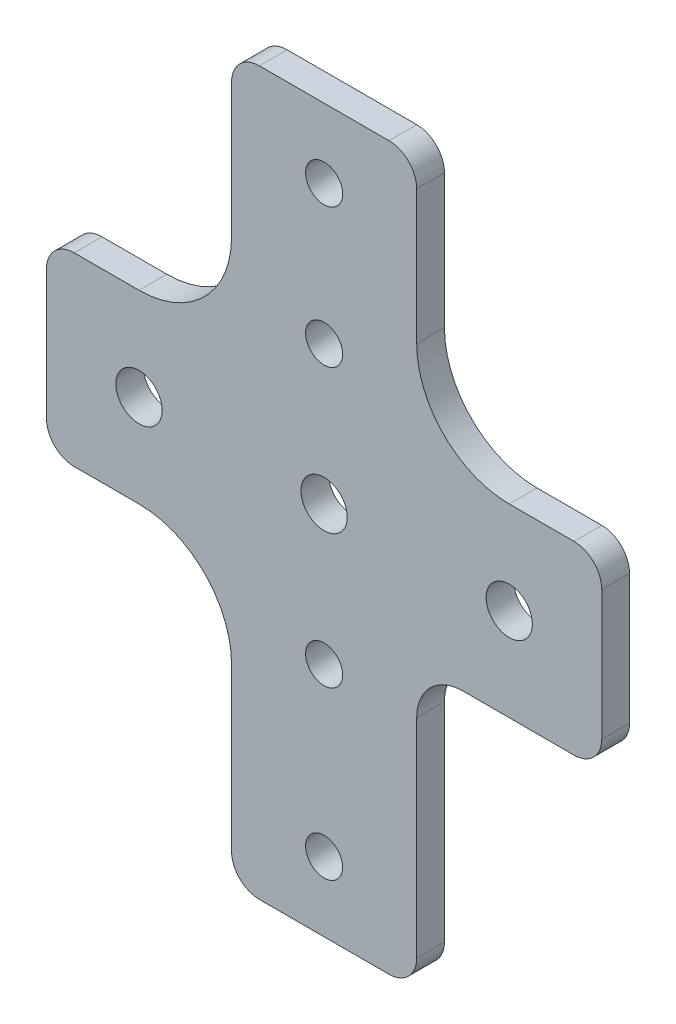
ISO-10303-21;
HEADER;
FILE_DESCRIPTION(('STEP AP214'),'2;1');
FILE_NAME('part.step','',(''),(''),'','','');
FILE_SCHEMA(('AUTOMOTIVE_DESIGN { 1 0 10303 214 1 1 1 1 }'));
ENDSEC;
DATA;
#1=APPLICATION_CONTEXT('core data for automotive mechanical design processes');
#2=APPLICATION_PROTOCOL_DEFINITION('international standard','automotive_design',2000,#1);
#3=PRODUCT_CONTEXT('',#1,'mechanical');
#4=PRODUCT('Part','Part','',(#3));
#5=PRODUCT_RELATED_PRODUCT_CATEGORY('part','',(#4));
#6=PRODUCT_DEFINITION_FORMATION('','',#4);
#7=PRODUCT_DEFINITION_CONTEXT('part definition',#1,'design');
#8=PRODUCT_DEFINITION('design','',#6,#7);
#9=PRODUCT_DEFINITION_SHAPE('','',#8);
#10=(LENGTH_UNIT() NAMED_UNIT(*) SI_UNIT(.MILLI.,.METRE.));
#11=(NAMED_UNIT(*) PLANE_ANGLE_UNIT() SI_UNIT($,.RADIAN.));
#12=(NAMED_UNIT(*) SI_UNIT($,.STERADIAN.) SOLID_ANGLE_UNIT());
#13=UNCERTAINTY_MEASURE_WITH_UNIT(LENGTH_MEASURE(1.E-05),#10,'distance_accuracy_value','');
#14=(GEOMETRIC_REPRESENTATION_CONTEXT(3) GLOBAL_UNCERTAINTY_ASSIGNED_CONTEXT((#13)) GLOBAL_UNIT_ASSIGNED_CONTEXT((#10,
#11,#12)) REPRESENTATION_CONTEXT('',''));
#15=CARTESIAN_POINT('',(0.,0.,0.));
#16=DIRECTION('',(0.,0.,1.));
#17=DIRECTION('',(1.,0.,0.));
#18=AXIS2_PLACEMENT_3D('',#15,#16,#17);
#19=CARTESIAN_POINT('',(-30.,10.,3.));
#20=DIRECTION('',(0.,-1.,0.));
#21=DIRECTION('',(0.,0.,-1.));
#22=AXIS2_PLACEMENT_3D('',#19,#20,#21);
#23=PLANE('',#22);
#24=DIRECTION('',(-1.,0.,0.));
#25=VECTOR('',#24,1.);
#26=CARTESIAN_POINT('',(-30.,10.,0.));
#27=LINE('',#26,#25);
#28=CARTESIAN_POINT('',(-20.,10.,0.));
#29=VERTEX_POINT('',#28);
#30=CARTESIAN_POINT('',(-27.,10.,0.));
#31=VERTEX_POINT('',#30);
#32=EDGE_CURVE('E210',#29,#31,#27,.T.);
#33=ORIENTED_EDGE('',*,*,#32,.T.);
#34=DIRECTION('',(0.,0.,-1.));
#35=VECTOR('',#34,1.);
#36=CARTESIAN_POINT('',(-27.,10.,3.));
#37=LINE('',#36,#35);
#38=CARTESIAN_POINT('',(-27.,10.,3.));
#39=VERTEX_POINT('',#38);
#40=EDGE_CURVE('E344',#31,#39,#37,.F.);
#41=ORIENTED_EDGE('',*,*,#40,.T.);
#42=DIRECTION('',(-1.,0.,0.));
#43=VECTOR('',#42,1.);
#44=CARTESIAN_POINT('',(-30.,10.,3.));
#45=LINE('',#44,#43);
#46=CARTESIAN_POINT('',(-20.,10.,3.));
#47=VERTEX_POINT('',#46);
#48=EDGE_CURVE('E213',#47,#39,#45,.T.);
#49=ORIENTED_EDGE('',*,*,#48,.F.);
#50=DIRECTION('',(0.,0.,-1.));
#51=VECTOR('',#50,1.);
#52=CARTESIAN_POINT('',(-20.,10.,0.));
#53=LINE('',#52,#51);
#54=EDGE_CURVE('E199',#47,#29,#53,.T.);
#55=ORIENTED_EDGE('',*,*,#54,.T.);
#56=EDGE_LOOP('',(#33,#41,#49,#55));
#57=FACE_BOUND('',#56,.T.);
#58=ADVANCED_FACE('F33',(#57),#23,.F.);
#59=CARTESIAN_POINT('',(-30.,-10.,3.));
#60=DIRECTION('',(1.,0.,0.));
#61=DIRECTION('',(0.,0.,-1.));
#62=AXIS2_PLACEMENT_3D('',#59,#60,#61);
#63=PLANE('',#62);
#64=DIRECTION('',(0.,-1.,0.));
#65=VECTOR('',#64,1.);
#66=CARTESIAN_POINT('',(-30.,-10.,0.));
#67=LINE('',#66,#65);
#68=CARTESIAN_POINT('',(-30.,7.,0.));
#69=VERTEX_POINT('',#68);
#70=CARTESIAN_POINT('',(-30.,-7.,0.));
#71=VERTEX_POINT('',#70);
#72=EDGE_CURVE('E219',#69,#71,#67,.T.);
#73=ORIENTED_EDGE('',*,*,#72,.T.);
#74=DIRECTION('',(0.,0.,-1.));
#75=VECTOR('',#74,1.);
#76=CARTESIAN_POINT('',(-30.,-7.,3.));
#77=LINE('',#76,#75);
#78=CARTESIAN_POINT('',(-30.,-7.,3.));
#79=VERTEX_POINT('',#78);
#80=EDGE_CURVE('E342',#71,#79,#77,.F.);
#81=ORIENTED_EDGE('',*,*,#80,.T.);
#82=DIRECTION('',(0.,-1.,0.));
#83=VECTOR('',#82,1.);
#84=CARTESIAN_POINT('',(-30.,-10.,3.));
#85=LINE('',#84,#83);
#86=CARTESIAN_POINT('',(-30.,7.,3.));
#87=VERTEX_POINT('',#86);
#88=EDGE_CURVE('E441',#87,#79,#85,.T.);
#89=ORIENTED_EDGE('',*,*,#88,.F.);
#90=DIRECTION('',(0.,0.,-1.));
#91=VECTOR('',#90,1.);
#92=CARTESIAN_POINT('',(-30.,7.,3.));
#93=LINE('',#92,#91);
#94=EDGE_CURVE('E339',#87,#69,#93,.T.);
#95=ORIENTED_EDGE('',*,*,#94,.T.);
#96=EDGE_LOOP('',(#73,#81,#89,#95));
#97=FACE_BOUND('',#96,.T.);
#98=ADVANCED_FACE('F411',(#97),#63,.F.);
#99=CARTESIAN_POINT('',(-30.,-10.,3.));
#100=DIRECTION('',(0.,1.,0.));
#101=DIRECTION('',(0.,0.,1.));
#102=AXIS2_PLACEMENT_3D('',#99,#100,#101);
#103=PLANE('',#102);
#104=DIRECTION('',(1.,0.,0.));
#105=VECTOR('',#104,1.);
#106=CARTESIAN_POINT('',(-30.,-10.,3.));
#107=LINE('',#106,#105);
#108=CARTESIAN_POINT('',(-27.,-10.,3.));
#109=VERTEX_POINT('',#108);
#110=CARTESIAN_POINT('',(-20.,-10.,3.));
#111=VERTEX_POINT('',#110);
#112=EDGE_CURVE('E435',#109,#111,#107,.T.);
#113=ORIENTED_EDGE('',*,*,#112,.F.);
#114=DIRECTION('',(0.,0.,-1.));
#115=VECTOR('',#114,1.);
#116=CARTESIAN_POINT('',(-27.,-10.,3.));
#117=LINE('',#116,#115);
#118=CARTESIAN_POINT('',(-27.,-10.,0.));
#119=VERTEX_POINT('',#118);
#120=EDGE_CURVE('E336',#109,#119,#117,.T.);
#121=ORIENTED_EDGE('',*,*,#120,.T.);
#122=DIRECTION('',(1.,0.,0.));
#123=VECTOR('',#122,1.);
#124=CARTESIAN_POINT('',(-30.,-10.,0.));
#125=LINE('',#124,#123);
#126=CARTESIAN_POINT('',(-20.,-10.,0.));
#127=VERTEX_POINT('',#126);
#128=EDGE_CURVE('E223',#119,#127,#125,.T.);
#129=ORIENTED_EDGE('',*,*,#128,.T.);
#130=DIRECTION('',(0.,0.,-1.));
#131=VECTOR('',#130,1.);
#132=CARTESIAN_POINT('',(-20.,-10.,3.));
#133=LINE('',#132,#131);
#134=EDGE_CURVE('E256',#127,#111,#133,.F.);
#135=ORIENTED_EDGE('',*,*,#134,.T.);
#136=EDGE_LOOP('',(#113,#121,#129,#135));
#137=FACE_BOUND('',#136,.T.);
#138=ADVANCED_FACE('F416',(#137),#103,.F.);
#139=CARTESIAN_POINT('',(-10.,-10.,3.));
#140=DIRECTION('',(1.,0.,0.));
#141=DIRECTION('',(0.,0.,-1.));
#142=AXIS2_PLACEMENT_3D('',#139,#140,#141);
#143=PLANE('',#142);
#144=DIRECTION('',(0.,-1.,0.));
#145=VECTOR('',#144,1.);
#146=CARTESIAN_POINT('',(-10.,-10.,0.));
#147=LINE('',#146,#145);
#148=CARTESIAN_POINT('',(-10.,-20.,0.));
#149=VERTEX_POINT('',#148);
#150=CARTESIAN_POINT('',(-10.,-37.5,0.));
#151=VERTEX_POINT('',#150);
#152=EDGE_CURVE('E232',#149,#151,#147,.T.);
#153=ORIENTED_EDGE('',*,*,#152,.T.);
#154=DIRECTION('',(0.,0.,1.));
#155=VECTOR('',#154,1.);
#156=CARTESIAN_POINT('',(-10.,-37.5,3.));
#157=LINE('',#156,#155);
#158=CARTESIAN_POINT('',(-10.,-37.5,3.));
#159=VERTEX_POINT('',#158);
#160=EDGE_CURVE('E333',#151,#159,#157,.T.);
#161=ORIENTED_EDGE('',*,*,#160,.T.);
#162=DIRECTION('',(0.,-1.,0.));
#163=VECTOR('',#162,1.);
#164=CARTESIAN_POINT('',(-10.,-10.,3.));
#165=LINE('',#164,#163);
#166=CARTESIAN_POINT('',(-10.,-20.,3.));
#167=VERTEX_POINT('',#166);
#168=EDGE_CURVE('E433',#167,#159,#165,.T.);
#169=ORIENTED_EDGE('',*,*,#168,.F.);
#170=DIRECTION('',(0.,0.,-1.));
#171=VECTOR('',#170,1.);
#172=CARTESIAN_POINT('',(-10.,-20.,0.));
#173=LINE('',#172,#171);
#174=EDGE_CURVE('E253',#167,#149,#173,.T.);
#175=ORIENTED_EDGE('',*,*,#174,.T.);
#176=EDGE_LOOP('',(#153,#161,#169,#175));
#177=FACE_BOUND('',#176,.T.);
#178=ADVANCED_FACE('F437',(#177),#143,.F.);
#179=CARTESIAN_POINT('',(10.,-10.,3.));
#180=DIRECTION('',(-1.,0.,0.));
#181=DIRECTION('',(0.,0.,1.));
#182=AXIS2_PLACEMENT_3D('',#179,#180,#181);
#183=PLANE('',#182);
#184=DIRECTION('',(0.,1.,0.));
#185=VECTOR('',#184,1.);
#186=CARTESIAN_POINT('',(10.,-10.,0.));
#187=LINE('',#186,#185);
#188=CARTESIAN_POINT('',(10.,-37.5,0.));
#189=VERTEX_POINT('',#188);
#190=CARTESIAN_POINT('',(10.,-15.,0.));
#191=VERTEX_POINT('',#190);
#192=EDGE_CURVE('E235',#189,#191,#187,.T.);
#193=ORIENTED_EDGE('',*,*,#192,.T.);
#194=DIRECTION('',(0.,0.,-1.));
#195=VECTOR('',#194,1.);
#196=CARTESIAN_POINT('',(10.,-15.,3.));
#197=LINE('',#196,#195);
#198=CARTESIAN_POINT('',(10.,-15.,3.));
#199=VERTEX_POINT('',#198);
#200=EDGE_CURVE('E54',#191,#199,#197,.F.);
#201=ORIENTED_EDGE('',*,*,#200,.T.);
#202=DIRECTION('',(0.,1.,0.));
#203=VECTOR('',#202,1.);
#204=CARTESIAN_POINT('',(10.,-10.,3.));
#205=LINE('',#204,#203);
#206=CARTESIAN_POINT('',(10.,-37.5,3.));
#207=VERTEX_POINT('',#206);
#208=EDGE_CURVE('E378',#207,#199,#205,.T.);
#209=ORIENTED_EDGE('',*,*,#208,.F.);
#210=DIRECTION('',(0.,0.,1.));
#211=VECTOR('',#210,1.);
#212=CARTESIAN_POINT('',(10.,-37.5,0.));
#213=LINE('',#212,#211);
#214=EDGE_CURVE('E331',#207,#189,#213,.F.);
#215=ORIENTED_EDGE('',*,*,#214,.T.);
#216=EDGE_LOOP('',(#193,#201,#209,#215));
#217=FACE_BOUND('',#216,.T.);
#218=ADVANCED_FACE('F555',(#217),#183,.F.);
#219=CARTESIAN_POINT('',(30.,-10.,3.));
#220=DIRECTION('',(0.,1.,0.));
#221=DIRECTION('',(-1.,0.,0.));
#222=AXIS2_PLACEMENT_3D('',#219,#220,#221);
#223=PLANE('',#222);
#224=DIRECTION('',(1.,0.,0.));
#225=VECTOR('',#224,1.);
#226=CARTESIAN_POINT('',(30.,-10.,3.));
#227=LINE('',#226,#225);
#228=CARTESIAN_POINT('',(15.,-10.,3.));
#229=VERTEX_POINT('',#228);
#230=CARTESIAN_POINT('',(27.,-10.,3.));
#231=VERTEX_POINT('',#230);
#232=EDGE_CURVE('E355',#229,#231,#227,.T.);
#233=ORIENTED_EDGE('',*,*,#232,.F.);
#234=DIRECTION('',(0.,0.,-1.));
#235=VECTOR('',#234,1.);
#236=CARTESIAN_POINT('',(15.,-10.,0.));
#237=LINE('',#236,#235);
#238=CARTESIAN_POINT('',(15.,-10.,0.));
#239=VERTEX_POINT('',#238);
#240=EDGE_CURVE('E348',#229,#239,#237,.T.);
#241=ORIENTED_EDGE('',*,*,#240,.T.);
#242=DIRECTION('',(1.,0.,0.));
#243=VECTOR('',#242,1.);
#244=CARTESIAN_POINT('',(30.,-10.,0.));
#245=LINE('',#244,#243);
#246=CARTESIAN_POINT('',(27.,-10.,0.));
#247=VERTEX_POINT('',#246);
#248=EDGE_CURVE('E237',#239,#247,#245,.T.);
#249=ORIENTED_EDGE('',*,*,#248,.T.);
#250=DIRECTION('',(0.,0.,-1.));
#251=VECTOR('',#250,1.);
#252=CARTESIAN_POINT('',(27.,-10.,3.));
#253=LINE('',#252,#251);
#254=EDGE_CURVE('E323',#247,#231,#253,.F.);
#255=ORIENTED_EDGE('',*,*,#254,.T.);
#256=EDGE_LOOP('',(#233,#241,#249,#255));
#257=FACE_BOUND('',#256,.T.);
#258=ADVANCED_FACE('F354',(#257),#223,.F.);
#259=CARTESIAN_POINT('',(30.,-10.,3.));
#260=DIRECTION('',(-1.,0.,0.));
#261=DIRECTION('',(0.,0.,1.));
#262=AXIS2_PLACEMENT_3D('',#259,#260,#261);
#263=PLANE('',#262);
#264=DIRECTION('',(0.,1.,0.));
#265=VECTOR('',#264,1.);
#266=CARTESIAN_POINT('',(30.,-10.,0.));
#267=LINE('',#266,#265);
#268=CARTESIAN_POINT('',(30.,-7.00000000000001,0.));
#269=VERTEX_POINT('',#268);
#270=CARTESIAN_POINT('',(30.,7.00000000000001,0.));
#271=VERTEX_POINT('',#270);
#272=EDGE_CURVE('E239',#269,#271,#267,.T.);
#273=ORIENTED_EDGE('',*,*,#272,.T.);
#274=DIRECTION('',(0.,0.,-1.));
#275=VECTOR('',#274,1.);
#276=CARTESIAN_POINT('',(30.,7.00000000000001,3.));
#277=LINE('',#276,#275);
#278=CARTESIAN_POINT('',(30.,7.00000000000001,3.));
#279=VERTEX_POINT('',#278);
#280=EDGE_CURVE('E321',#271,#279,#277,.F.);
#281=ORIENTED_EDGE('',*,*,#280,.T.);
#282=DIRECTION('',(0.,1.,0.));
#283=VECTOR('',#282,1.);
#284=CARTESIAN_POINT('',(30.,-10.,3.));
#285=LINE('',#284,#283);
#286=CARTESIAN_POINT('',(30.,-7.00000000000001,3.));
#287=VERTEX_POINT('',#286);
#288=EDGE_CURVE('E369',#287,#279,#285,.T.);
#289=ORIENTED_EDGE('',*,*,#288,.F.);
#290=DIRECTION('',(0.,0.,-1.));
#291=VECTOR('',#290,1.);
#292=CARTESIAN_POINT('',(30.,-7.00000000000001,3.));
#293=LINE('',#292,#291);
#294=EDGE_CURVE('E318',#287,#269,#293,.T.);
#295=ORIENTED_EDGE('',*,*,#294,.T.);
#296=EDGE_LOOP('',(#273,#281,#289,#295));
#297=FACE_BOUND('',#296,.T.);
#298=ADVANCED_FACE('F372',(#297),#263,.F.);
#299=CARTESIAN_POINT('',(30.,10.,3.));
#300=DIRECTION('',(0.,-1.,0.));
#301=DIRECTION('',(1.,0.,0.));
#302=AXIS2_PLACEMENT_3D('',#299,#300,#301);
#303=PLANE('',#302);
#304=DIRECTION('',(-1.,0.,0.));
#305=VECTOR('',#304,1.);
#306=CARTESIAN_POINT('',(30.,10.,3.));
#307=LINE('',#306,#305);
#308=CARTESIAN_POINT('',(27.,10.,3.));
#309=VERTEX_POINT('',#308);
#310=CARTESIAN_POINT('',(20.,10.,3.));
#311=VERTEX_POINT('',#310);
#312=EDGE_CURVE('E374',#309,#311,#307,.T.);
#313=ORIENTED_EDGE('',*,*,#312,.F.);
#314=DIRECTION('',(0.,0.,-1.));
#315=VECTOR('',#314,1.);
#316=CARTESIAN_POINT('',(27.,10.,3.));
#317=LINE('',#316,#315);
#318=CARTESIAN_POINT('',(27.,10.,0.));
#319=VERTEX_POINT('',#318);
#320=EDGE_CURVE('E315',#309,#319,#317,.T.);
#321=ORIENTED_EDGE('',*,*,#320,.T.);
#322=DIRECTION('',(-1.,0.,0.));
#323=VECTOR('',#322,1.);
#324=CARTESIAN_POINT('',(30.,10.,0.));
#325=LINE('',#324,#323);
#326=CARTESIAN_POINT('',(20.,10.,0.));
#327=VERTEX_POINT('',#326);
#328=EDGE_CURVE('E242',#319,#327,#325,.T.);
#329=ORIENTED_EDGE('',*,*,#328,.T.);
#330=DIRECTION('',(0.,0.,-1.));
#331=VECTOR('',#330,1.);
#332=CARTESIAN_POINT('',(20.,10.,3.));
#333=LINE('',#332,#331);
#334=EDGE_CURVE('E205',#327,#311,#333,.F.);
#335=ORIENTED_EDGE('',*,*,#334,.T.);
#336=EDGE_LOOP('',(#313,#321,#329,#335));
#337=FACE_BOUND('',#336,.T.);
#338=ADVANCED_FACE('F546',(#337),#303,.F.);
#339=CARTESIAN_POINT('',(10.,10.,3.));
#340=DIRECTION('',(-1.,0.,0.));
#341=DIRECTION('',(0.,0.,1.));
#342=AXIS2_PLACEMENT_3D('',#339,#340,#341);
#343=PLANE('',#342);
#344=DIRECTION('',(0.,1.,0.));
#345=VECTOR('',#344,1.);
#346=CARTESIAN_POINT('',(10.,10.,0.));
#347=LINE('',#346,#345);
#348=CARTESIAN_POINT('',(10.,20.,0.));
#349=VERTEX_POINT('',#348);
#350=CARTESIAN_POINT('',(10.,34.5,0.));
#351=VERTEX_POINT('',#350);
#352=EDGE_CURVE('E244',#349,#351,#347,.T.);
#353=ORIENTED_EDGE('',*,*,#352,.T.);
#354=DIRECTION('',(0.,0.,-1.));
#355=VECTOR('',#354,1.);
#356=CARTESIAN_POINT('',(10.,34.5,3.));
#357=LINE('',#356,#355);
#358=CARTESIAN_POINT('',(10.,34.5,3.));
#359=VERTEX_POINT('',#358);
#360=EDGE_CURVE('E346',#351,#359,#357,.F.);
#361=ORIENTED_EDGE('',*,*,#360,.T.);
#362=DIRECTION('',(0.,1.,0.));
#363=VECTOR('',#362,1.);
#364=CARTESIAN_POINT('',(10.,10.,3.));
#365=LINE('',#364,#363);
#366=CARTESIAN_POINT('',(10.,20.,3.));
#367=VERTEX_POINT('',#366);
#368=EDGE_CURVE('E376',#367,#359,#365,.T.);
#369=ORIENTED_EDGE('',*,*,#368,.F.);
#370=DIRECTION('',(0.,0.,-1.));
#371=VECTOR('',#370,1.);
#372=CARTESIAN_POINT('',(10.,20.,0.));
#373=LINE('',#372,#371);
#374=EDGE_CURVE('E259',#367,#349,#373,.T.);
#375=ORIENTED_EDGE('',*,*,#374,.T.);
#376=EDGE_LOOP('',(#353,#361,#369,#375));
#377=FACE_BOUND('',#376,.T.);
#378=ADVANCED_FACE('F543',(#377),#343,.F.);
#379=CARTESIAN_POINT('',(-10.,37.5,3.));
#380=DIRECTION('',(0.,-1.,0.));
#381=DIRECTION('',(0.,0.,-1.));
#382=AXIS2_PLACEMENT_3D('',#379,#380,#381);
#383=PLANE('',#382);
#384=DIRECTION('',(-1.,0.,0.));
#385=VECTOR('',#384,1.);
#386=CARTESIAN_POINT('',(-10.,37.5,0.));
#387=LINE('',#386,#385);
#388=CARTESIAN_POINT('',(7.,37.5,0.));
#389=VERTEX_POINT('',#388);
#390=CARTESIAN_POINT('',(-7.,37.5,0.));
#391=VERTEX_POINT('',#390);
#392=EDGE_CURVE('E247',#389,#391,#387,.T.);
#393=ORIENTED_EDGE('',*,*,#392,.T.);
#394=DIRECTION('',(0.,0.,-1.));
#395=VECTOR('',#394,1.);
#396=CARTESIAN_POINT('',(-7.,37.5,3.));
#397=LINE('',#396,#395);
#398=CARTESIAN_POINT('',(-7.,37.5,3.));
#399=VERTEX_POINT('',#398);
#400=EDGE_CURVE('E297',#391,#399,#397,.F.);
#401=ORIENTED_EDGE('',*,*,#400,.T.);
#402=DIRECTION('',(-1.,0.,0.));
#403=VECTOR('',#402,1.);
#404=CARTESIAN_POINT('',(-10.,37.5,3.));
#405=LINE('',#404,#403);
#406=CARTESIAN_POINT('',(7.,37.5,3.));
#407=VERTEX_POINT('',#406);
#408=EDGE_CURVE('E383',#407,#399,#405,.T.);
#409=ORIENTED_EDGE('',*,*,#408,.F.);
#410=DIRECTION('',(0.,0.,-1.));
#411=VECTOR('',#410,1.);
#412=CARTESIAN_POINT('',(7.,37.5,3.));
#413=LINE('',#412,#411);
#414=EDGE_CURVE('E294',#407,#389,#413,.T.);
#415=ORIENTED_EDGE('',*,*,#414,.T.);
#416=EDGE_LOOP('',(#393,#401,#409,#415));
#417=FACE_BOUND('',#416,.T.);
#418=ADVANCED_FACE('F394',(#417),#383,.F.);
#419=CARTESIAN_POINT('',(-10.,10.,3.));
#420=DIRECTION('',(1.,0.,0.));
#421=DIRECTION('',(0.,0.,-1.));
#422=AXIS2_PLACEMENT_3D('',#419,#420,#421);
#423=PLANE('',#422);
#424=DIRECTION('',(0.,-1.,0.));
#425=VECTOR('',#424,1.);
#426=CARTESIAN_POINT('',(-10.,10.,3.));
#427=LINE('',#426,#425);
#428=CARTESIAN_POINT('',(-10.,34.5,3.));
#429=VERTEX_POINT('',#428);
#430=CARTESIAN_POINT('',(-10.,20.,3.));
#431=VERTEX_POINT('',#430);
#432=EDGE_CURVE('E214',#429,#431,#427,.T.);
#433=ORIENTED_EDGE('',*,*,#432,.F.);
#434=DIRECTION('',(0.,0.,-1.));
#435=VECTOR('',#434,1.);
#436=CARTESIAN_POINT('',(-10.,34.5,3.));
#437=LINE('',#436,#435);
#438=CARTESIAN_POINT('',(-10.,34.5,0.));
#439=VERTEX_POINT('',#438);
#440=EDGE_CURVE('E275',#429,#439,#437,.T.);
#441=ORIENTED_EDGE('',*,*,#440,.T.);
#442=DIRECTION('',(0.,-1.,0.));
#443=VECTOR('',#442,1.);
#444=CARTESIAN_POINT('',(-10.,10.,0.));
#445=LINE('',#444,#443);
#446=CARTESIAN_POINT('',(-10.,20.,0.));
#447=VERTEX_POINT('',#446);
#448=EDGE_CURVE('E250',#439,#447,#445,.T.);
#449=ORIENTED_EDGE('',*,*,#448,.T.);
#450=DIRECTION('',(0.,0.,-1.));
#451=VECTOR('',#450,1.);
#452=CARTESIAN_POINT('',(-10.,20.,3.));
#453=LINE('',#452,#451);
#454=EDGE_CURVE('E201',#447,#431,#453,.F.);
#455=ORIENTED_EDGE('',*,*,#454,.T.);
#456=EDGE_LOOP('',(#433,#441,#449,#455));
#457=FACE_BOUND('',#456,.T.);
#458=ADVANCED_FACE('F389',(#457),#423,.F.);
#459=CARTESIAN_POINT('',(0.,0.,3.));
#460=DIRECTION('',(0.,0.,1.));
#461=DIRECTION('',(1.,0.,0.));
#462=AXIS2_PLACEMENT_3D('',#459,#460,#461);
#463=PLANE('',#462);
#464=CARTESIAN_POINT('',(-20.,0.,3.));
#465=DIRECTION('',(0.,0.,1.));
#466=DIRECTION('',(1.,0.,0.));
#467=AXIS2_PLACEMENT_3D('',#464,#465,#466);
#468=CIRCLE('',#467,2.5);
#469=CARTESIAN_POINT('',(-17.5,0.,3.));
#470=VERTEX_POINT('',#469);
#471=EDGE_CURVE('E486',#470,#470,#468,.T.);
#472=ORIENTED_EDGE('',*,*,#471,.F.);
#473=EDGE_LOOP('',(#472));
#474=FACE_BOUND('',#473,.T.);
#475=CARTESIAN_POINT('',(0.,0.,3.));
#476=DIRECTION('',(0.,0.,1.));
#477=DIRECTION('',(1.,0.,0.));
#478=AXIS2_PLACEMENT_3D('',#475,#476,#477);
#479=CIRCLE('',#478,2.5);
#480=CARTESIAN_POINT('',(2.5,0.,3.));
#481=VERTEX_POINT('',#480);
#482=EDGE_CURVE('E480',#481,#481,#479,.T.);
#483=ORIENTED_EDGE('',*,*,#482,.F.);
#484=EDGE_LOOP('',(#483));
#485=FACE_BOUND('',#484,.T.);
#486=CARTESIAN_POINT('',(20.,0.,3.));
#487=DIRECTION('',(0.,0.,1.));
#488=DIRECTION('',(-1.,0.,0.));
#489=AXIS2_PLACEMENT_3D('',#486,#487,#488);
#490=CIRCLE('',#489,2.5);
#491=CARTESIAN_POINT('',(17.5,0.,3.));
#492=VERTEX_POINT('',#491);
#493=EDGE_CURVE('E474',#492,#492,#490,.T.);
#494=ORIENTED_EDGE('',*,*,#493,.F.);
#495=EDGE_LOOP('',(#494));
#496=FACE_BOUND('',#495,.T.);
#497=CARTESIAN_POINT('',(0.,30.,3.));
#498=DIRECTION('',(0.,0.,1.));
#499=DIRECTION('',(1.,0.,0.));
#500=AXIS2_PLACEMENT_3D('',#497,#498,#499);
#501=CIRCLE('',#500,2.);
#502=CARTESIAN_POINT('',(2.,30.,3.));
#503=VERTEX_POINT('',#502);
#504=EDGE_CURVE('E469',#503,#503,#501,.T.);
#505=ORIENTED_EDGE('',*,*,#504,.F.);
#506=EDGE_LOOP('',(#505));
#507=FACE_BOUND('',#506,.T.);
#508=CARTESIAN_POINT('',(0.,15.,3.));
#509=DIRECTION('',(0.,0.,1.));
#510=DIRECTION('',(1.,0.,0.));
#511=AXIS2_PLACEMENT_3D('',#508,#509,#510);
#512=CIRCLE('',#511,2.);
#513=CARTESIAN_POINT('',(2.,15.,3.));
#514=VERTEX_POINT('',#513);
#515=EDGE_CURVE('E463',#514,#514,#512,.T.);
#516=ORIENTED_EDGE('',*,*,#515,.F.);
#517=EDGE_LOOP('',(#516));
#518=FACE_BOUND('',#517,.T.);
#519=CARTESIAN_POINT('',(0.,-15.,3.));
#520=DIRECTION('',(0.,0.,1.));
#521=DIRECTION('',(1.,0.,0.));
#522=AXIS2_PLACEMENT_3D('',#519,#520,#521);
#523=CIRCLE('',#522,2.);
#524=CARTESIAN_POINT('',(2.00000000000001,-15.,3.));
#525=VERTEX_POINT('',#524);
#526=EDGE_CURVE('E457',#525,#525,#523,.T.);
#527=ORIENTED_EDGE('',*,*,#526,.F.);
#528=EDGE_LOOP('',(#527));
#529=FACE_BOUND('',#528,.T.);
#530=CARTESIAN_POINT('',(0.,-33.,3.));
#531=DIRECTION('',(0.,0.,1.));
#532=DIRECTION('',(1.,0.,0.));
#533=AXIS2_PLACEMENT_3D('',#530,#531,#532);
#534=CIRCLE('',#533,2.);
#535=CARTESIAN_POINT('',(2.00000000000001,-33.,3.));
#536=VERTEX_POINT('',#535);
#537=EDGE_CURVE('E450',#536,#536,#534,.T.);
#538=ORIENTED_EDGE('',*,*,#537,.F.);
#539=EDGE_LOOP('',(#538));
#540=FACE_BOUND('',#539,.T.);
#541=ORIENTED_EDGE('',*,*,#408,.T.);
#542=CARTESIAN_POINT('',(-7.,34.5,3.));
#543=DIRECTION('',(0.,0.,1.));
#544=DIRECTION('',(1.,0.,0.));
#545=AXIS2_PLACEMENT_3D('',#542,#543,#544);
#546=CIRCLE('',#545,3.);
#547=EDGE_CURVE('E313',#399,#429,#546,.T.);
#548=ORIENTED_EDGE('',*,*,#547,.T.);
#549=ORIENTED_EDGE('',*,*,#432,.T.);
#550=CARTESIAN_POINT('',(-20.,20.,3.));
#551=DIRECTION('',(0.,0.,1.));
#552=DIRECTION('',(1.,0.,0.));
#553=AXIS2_PLACEMENT_3D('',#550,#551,#552);
#554=CIRCLE('',#553,10.);
#555=EDGE_CURVE('E204',#431,#47,#554,.F.);
#556=ORIENTED_EDGE('',*,*,#555,.T.);
#557=ORIENTED_EDGE('',*,*,#48,.T.);
#558=CARTESIAN_POINT('',(-27.,7.,3.));
#559=DIRECTION('',(0.,0.,1.));
#560=DIRECTION('',(1.,0.,0.));
#561=AXIS2_PLACEMENT_3D('',#558,#559,#560);
#562=CIRCLE('',#561,3.);
#563=EDGE_CURVE('E301',#39,#87,#562,.T.);
#564=ORIENTED_EDGE('',*,*,#563,.T.);
#565=ORIENTED_EDGE('',*,*,#88,.T.);
#566=CARTESIAN_POINT('',(-27.,-7.,3.));
#567=DIRECTION('',(0.,0.,1.));
#568=DIRECTION('',(1.,0.,0.));
#569=AXIS2_PLACEMENT_3D('',#566,#567,#568);
#570=CIRCLE('',#569,3.);
#571=EDGE_CURVE('E303',#79,#109,#570,.T.);
#572=ORIENTED_EDGE('',*,*,#571,.T.);
#573=ORIENTED_EDGE('',*,*,#112,.T.);
#574=CARTESIAN_POINT('',(-20.,-20.,3.));
#575=DIRECTION('',(0.,0.,1.));
#576=DIRECTION('',(1.,0.,0.));
#577=AXIS2_PLACEMENT_3D('',#574,#575,#576);
#578=CIRCLE('',#577,10.);
#579=EDGE_CURVE('E268',#111,#167,#578,.F.);
#580=ORIENTED_EDGE('',*,*,#579,.T.);
#581=ORIENTED_EDGE('',*,*,#168,.T.);
#582=CARTESIAN_POINT('',(-7.,-37.5,3.));
#583=DIRECTION('',(0.,0.,1.));
#584=DIRECTION('',(1.,0.,0.));
#585=AXIS2_PLACEMENT_3D('',#582,#583,#584);
#586=CIRCLE('',#585,3.);
#587=CARTESIAN_POINT('',(-7.,-40.5,3.));
#588=VERTEX_POINT('',#587);
#589=EDGE_CURVE('E305',#159,#588,#586,.T.);
#590=ORIENTED_EDGE('',*,*,#589,.T.);
#591=DIRECTION('',(1.,0.,0.));
#592=VECTOR('',#591,1.);
#593=CARTESIAN_POINT('',(10.,-40.5,3.));
#594=LINE('',#593,#592);
#595=CARTESIAN_POINT('',(7.,-40.5,3.));
#596=VERTEX_POINT('',#595);
#597=EDGE_CURVE('E226',#588,#596,#594,.T.);
#598=ORIENTED_EDGE('',*,*,#597,.T.);
#599=CARTESIAN_POINT('',(7.,-37.5,3.));
#600=DIRECTION('',(0.,0.,1.));
#601=DIRECTION('',(1.,0.,0.));
#602=AXIS2_PLACEMENT_3D('',#599,#600,#601);
#603=CIRCLE('',#602,3.);
#604=EDGE_CURVE('E307',#596,#207,#603,.T.);
#605=ORIENTED_EDGE('',*,*,#604,.T.);
#606=ORIENTED_EDGE('',*,*,#208,.T.);
#607=CARTESIAN_POINT('',(15.,-15.,3.));
#608=DIRECTION('',(0.,0.,1.));
#609=DIRECTION('',(1.,0.,0.));
#610=AXIS2_PLACEMENT_3D('',#607,#608,#609);
#611=CIRCLE('',#610,5.);
#612=EDGE_CURVE('E11',#199,#229,#611,.F.);
#613=ORIENTED_EDGE('',*,*,#612,.T.);
#614=ORIENTED_EDGE('',*,*,#232,.T.);
#615=CARTESIAN_POINT('',(27.,-7.00000000000001,3.));
#616=DIRECTION('',(0.,0.,1.));
#617=DIRECTION('',(1.,0.,0.));
#618=AXIS2_PLACEMENT_3D('',#615,#616,#617);
#619=CIRCLE('',#618,3.);
#620=EDGE_CURVE('E309',#231,#287,#619,.T.);
#621=ORIENTED_EDGE('',*,*,#620,.T.);
#622=ORIENTED_EDGE('',*,*,#288,.T.);
#623=CARTESIAN_POINT('',(27.,7.00000000000001,3.));
#624=DIRECTION('',(0.,0.,1.));
#625=DIRECTION('',(1.,0.,0.));
#626=AXIS2_PLACEMENT_3D('',#623,#624,#625);
#627=CIRCLE('',#626,3.);
#628=EDGE_CURVE('E311',#279,#309,#627,.T.);
#629=ORIENTED_EDGE('',*,*,#628,.T.);
#630=ORIENTED_EDGE('',*,*,#312,.T.);
#631=CARTESIAN_POINT('',(20.,20.,3.));
#632=DIRECTION('',(0.,0.,1.));
#633=DIRECTION('',(1.,0.,0.));
#634=AXIS2_PLACEMENT_3D('',#631,#632,#633);
#635=CIRCLE('',#634,10.);
#636=EDGE_CURVE('E273',#311,#367,#635,.F.);
#637=ORIENTED_EDGE('',*,*,#636,.T.);
#638=ORIENTED_EDGE('',*,*,#368,.T.);
#639=CARTESIAN_POINT('',(7.,34.5,3.));
#640=DIRECTION('',(0.,0.,1.));
#641=DIRECTION('',(1.,0.,0.));
#642=AXIS2_PLACEMENT_3D('',#639,#640,#641);
#643=CIRCLE('',#642,3.);
#644=EDGE_CURVE('E299',#359,#407,#643,.T.);
#645=ORIENTED_EDGE('',*,*,#644,.T.);
#646=EDGE_LOOP('',(#541,#548,#549,#556,#557,#564,#565,#572,#573,#580,#581,#590,#598,#605,#606,
#613,#614,#621,#622,#629,#630,#637,#638,#645));
#647=FACE_BOUND('',#646,.T.);
#648=ADVANCED_FACE('F368',(#474,#485,#496,#507,#518,#529,#540,#647),#463,.T.);
#649=CARTESIAN_POINT('',(0.,0.,0.));
#650=DIRECTION('',(0.,0.,1.));
#651=DIRECTION('',(1.,0.,0.));
#652=AXIS2_PLACEMENT_3D('',#649,#650,#651);
#653=PLANE('',#652);
#654=CARTESIAN_POINT('',(-20.,0.,0.));
#655=DIRECTION('',(0.,0.,1.));
#656=DIRECTION('',(1.,0.,0.));
#657=AXIS2_PLACEMENT_3D('',#654,#655,#656);
#658=CIRCLE('',#657,2.5);
#659=CARTESIAN_POINT('',(-17.5,0.,0.));
#660=VERTEX_POINT('',#659);
#661=EDGE_CURVE('E454',#660,#660,#658,.T.);
#662=ORIENTED_EDGE('',*,*,#661,.T.);
#663=EDGE_LOOP('',(#662));
#664=FACE_BOUND('',#663,.T.);
#665=CARTESIAN_POINT('',(0.,0.,0.));
#666=DIRECTION('',(0.,0.,1.));
#667=DIRECTION('',(1.,0.,0.));
#668=AXIS2_PLACEMENT_3D('',#665,#666,#667);
#669=CIRCLE('',#668,2.5);
#670=CARTESIAN_POINT('',(2.5,0.,0.));
#671=VERTEX_POINT('',#670);
#672=EDGE_CURVE('E483',#671,#671,#669,.T.);
#673=ORIENTED_EDGE('',*,*,#672,.T.);
#674=EDGE_LOOP('',(#673));
#675=FACE_BOUND('',#674,.T.);
#676=CARTESIAN_POINT('',(20.,0.,0.));
#677=DIRECTION('',(0.,0.,1.));
#678=DIRECTION('',(-1.,0.,0.));
#679=AXIS2_PLACEMENT_3D('',#676,#677,#678);
#680=CIRCLE('',#679,2.5);
#681=CARTESIAN_POINT('',(17.5,0.,0.));
#682=VERTEX_POINT('',#681);
#683=EDGE_CURVE('E477',#682,#682,#680,.T.);
#684=ORIENTED_EDGE('',*,*,#683,.T.);
#685=EDGE_LOOP('',(#684));
#686=FACE_BOUND('',#685,.T.);
#687=CARTESIAN_POINT('',(0.,30.,0.));
#688=DIRECTION('',(0.,0.,1.));
#689=DIRECTION('',(1.,0.,0.));
#690=AXIS2_PLACEMENT_3D('',#687,#688,#689);
#691=CIRCLE('',#690,2.);
#692=CARTESIAN_POINT('',(2.,30.,0.));
#693=VERTEX_POINT('',#692);
#694=EDGE_CURVE('E449',#693,#693,#691,.T.);
#695=ORIENTED_EDGE('',*,*,#694,.T.);
#696=EDGE_LOOP('',(#695));
#697=FACE_BOUND('',#696,.T.);
#698=CARTESIAN_POINT('',(0.,15.,0.));
#699=DIRECTION('',(0.,0.,1.));
#700=DIRECTION('',(1.,0.,0.));
#701=AXIS2_PLACEMENT_3D('',#698,#699,#700);
#702=CIRCLE('',#701,2.);
#703=CARTESIAN_POINT('',(2.,15.,0.));
#704=VERTEX_POINT('',#703);
#705=EDGE_CURVE('E466',#704,#704,#702,.T.);
#706=ORIENTED_EDGE('',*,*,#705,.T.);
#707=EDGE_LOOP('',(#706));
#708=FACE_BOUND('',#707,.T.);
#709=CARTESIAN_POINT('',(0.,-15.,0.));
#710=DIRECTION('',(0.,0.,1.));
#711=DIRECTION('',(1.,0.,0.));
#712=AXIS2_PLACEMENT_3D('',#709,#710,#711);
#713=CIRCLE('',#712,2.);
#714=CARTESIAN_POINT('',(2.00000000000001,-15.,0.));
#715=VERTEX_POINT('',#714);
#716=EDGE_CURVE('E460',#715,#715,#713,.T.);
#717=ORIENTED_EDGE('',*,*,#716,.T.);
#718=EDGE_LOOP('',(#717));
#719=FACE_BOUND('',#718,.T.);
#720=CARTESIAN_POINT('',(0.,-33.,0.));
#721=DIRECTION('',(0.,0.,1.));
#722=DIRECTION('',(1.,0.,0.));
#723=AXIS2_PLACEMENT_3D('',#720,#721,#722);
#724=CIRCLE('',#723,2.);
#725=CARTESIAN_POINT('',(2.00000000000001,-33.,0.));
#726=VERTEX_POINT('',#725);
#727=EDGE_CURVE('E453',#726,#726,#724,.T.);
#728=ORIENTED_EDGE('',*,*,#727,.T.);
#729=EDGE_LOOP('',(#728));
#730=FACE_BOUND('',#729,.T.);
#731=ORIENTED_EDGE('',*,*,#448,.F.);
#732=CARTESIAN_POINT('',(-7.,34.5,0.));
#733=DIRECTION('',(0.,0.,1.));
#734=DIRECTION('',(1.,0.,0.));
#735=AXIS2_PLACEMENT_3D('',#732,#733,#734);
#736=CIRCLE('',#735,3.);
#737=EDGE_CURVE('E292',#439,#391,#736,.F.);
#738=ORIENTED_EDGE('',*,*,#737,.T.);
#739=ORIENTED_EDGE('',*,*,#392,.F.);
#740=CARTESIAN_POINT('',(7.,34.5,0.));
#741=DIRECTION('',(0.,0.,1.));
#742=DIRECTION('',(1.,0.,0.));
#743=AXIS2_PLACEMENT_3D('',#740,#741,#742);
#744=CIRCLE('',#743,3.);
#745=EDGE_CURVE('E278',#389,#351,#744,.F.);
#746=ORIENTED_EDGE('',*,*,#745,.T.);
#747=ORIENTED_EDGE('',*,*,#352,.F.);
#748=CARTESIAN_POINT('',(20.,20.,0.));
#749=DIRECTION('',(0.,0.,1.));
#750=DIRECTION('',(1.,0.,0.));
#751=AXIS2_PLACEMENT_3D('',#748,#749,#750);
#752=CIRCLE('',#751,10.);
#753=EDGE_CURVE('E270',#349,#327,#752,.T.);
#754=ORIENTED_EDGE('',*,*,#753,.T.);
#755=ORIENTED_EDGE('',*,*,#328,.F.);
#756=CARTESIAN_POINT('',(27.,7.00000000000001,0.));
#757=DIRECTION('',(0.,0.,1.));
#758=DIRECTION('',(1.,0.,0.));
#759=AXIS2_PLACEMENT_3D('',#756,#757,#758);
#760=CIRCLE('',#759,3.);
#761=EDGE_CURVE('E290',#319,#271,#760,.F.);
#762=ORIENTED_EDGE('',*,*,#761,.T.);
#763=ORIENTED_EDGE('',*,*,#272,.F.);
#764=CARTESIAN_POINT('',(27.,-7.00000000000001,0.));
#765=DIRECTION('',(0.,0.,1.));
#766=DIRECTION('',(1.,0.,0.));
#767=AXIS2_PLACEMENT_3D('',#764,#765,#766);
#768=CIRCLE('',#767,3.);
#769=EDGE_CURVE('E287',#269,#247,#768,.F.);
#770=ORIENTED_EDGE('',*,*,#769,.T.);
#771=ORIENTED_EDGE('',*,*,#248,.F.);
#772=CARTESIAN_POINT('',(15.,-15.,0.));
#773=DIRECTION('',(0.,0.,1.));
#774=DIRECTION('',(1.,0.,0.));
#775=AXIS2_PLACEMENT_3D('',#772,#773,#774);
#776=CIRCLE('',#775,5.);
#777=EDGE_CURVE('E41',#239,#191,#776,.T.);
#778=ORIENTED_EDGE('',*,*,#777,.T.);
#779=ORIENTED_EDGE('',*,*,#192,.F.);
#780=CARTESIAN_POINT('',(7.,-37.5,0.));
#781=DIRECTION('',(0.,0.,1.));
#782=DIRECTION('',(1.,0.,0.));
#783=AXIS2_PLACEMENT_3D('',#780,#781,#782);
#784=CIRCLE('',#783,3.);
#785=CARTESIAN_POINT('',(7.,-40.5,0.));
#786=VERTEX_POINT('',#785);
#787=EDGE_CURVE('E285',#189,#786,#784,.F.);
#788=ORIENTED_EDGE('',*,*,#787,.T.);
#789=DIRECTION('',(-1.,0.,0.));
#790=VECTOR('',#789,1.);
#791=CARTESIAN_POINT('',(10.,-40.5,0.));
#792=LINE('',#791,#790);
#793=CARTESIAN_POINT('',(-7.,-40.5,0.));
#794=VERTEX_POINT('',#793);
#795=EDGE_CURVE('E220',#786,#794,#792,.T.);
#796=ORIENTED_EDGE('',*,*,#795,.T.);
#797=CARTESIAN_POINT('',(-7.,-37.5,0.));
#798=DIRECTION('',(0.,0.,1.));
#799=DIRECTION('',(1.,0.,0.));
#800=AXIS2_PLACEMENT_3D('',#797,#798,#799);
#801=CIRCLE('',#800,3.);
#802=EDGE_CURVE('E283',#794,#151,#801,.F.);
#803=ORIENTED_EDGE('',*,*,#802,.T.);
#804=ORIENTED_EDGE('',*,*,#152,.F.);
#805=CARTESIAN_POINT('',(-20.,-20.,0.));
#806=DIRECTION('',(0.,0.,1.));
#807=DIRECTION('',(1.,0.,0.));
#808=AXIS2_PLACEMENT_3D('',#805,#806,#807);
#809=CIRCLE('',#808,10.);
#810=EDGE_CURVE('E265',#149,#127,#809,.T.);
#811=ORIENTED_EDGE('',*,*,#810,.T.);
#812=ORIENTED_EDGE('',*,*,#128,.F.);
#813=CARTESIAN_POINT('',(-27.,-7.,0.));
#814=DIRECTION('',(0.,0.,1.));
#815=DIRECTION('',(1.,0.,0.));
#816=AXIS2_PLACEMENT_3D('',#813,#814,#815);
#817=CIRCLE('',#816,3.);
#818=EDGE_CURVE('E281',#119,#71,#817,.F.);
#819=ORIENTED_EDGE('',*,*,#818,.T.);
#820=ORIENTED_EDGE('',*,*,#72,.F.);
#821=CARTESIAN_POINT('',(-27.,7.,0.));
#822=DIRECTION('',(0.,0.,1.));
#823=DIRECTION('',(1.,0.,0.));
#824=AXIS2_PLACEMENT_3D('',#821,#822,#823);
#825=CIRCLE('',#824,3.);
#826=EDGE_CURVE('E218',#69,#31,#825,.F.);
#827=ORIENTED_EDGE('',*,*,#826,.T.);
#828=ORIENTED_EDGE('',*,*,#32,.F.);
#829=CARTESIAN_POINT('',(-20.,20.,0.));
#830=DIRECTION('',(0.,0.,1.));
#831=DIRECTION('',(1.,0.,0.));
#832=AXIS2_PLACEMENT_3D('',#829,#830,#831);
#833=CIRCLE('',#832,10.);
#834=EDGE_CURVE('E195',#29,#447,#833,.T.);
#835=ORIENTED_EDGE('',*,*,#834,.T.);
#836=EDGE_LOOP('',(#731,#738,#739,#746,#747,#754,#755,#762,#763,#770,#771,#778,#779,#788,#796,
#803,#804,#811,#812,#819,#820,#827,#828,#835));
#837=FACE_BOUND('',#836,.T.);
#838=ADVANCED_FACE('F216',(#664,#675,#686,#697,#708,#719,#730,#837),#653,.F.);
#839=CARTESIAN_POINT('',(10.,-40.5,-20.2237484161567));
#840=DIRECTION('',(0.,-1.,0.));
#841=DIRECTION('',(0.,0.,-1.));
#842=AXIS2_PLACEMENT_3D('',#839,#840,#841);
#843=PLANE('',#842);
#844=ORIENTED_EDGE('',*,*,#795,.F.);
#845=DIRECTION('',(0.,0.,1.));
#846=VECTOR('',#845,1.);
#847=CARTESIAN_POINT('',(7.,-40.5,3.));
#848=LINE('',#847,#846);
#849=EDGE_CURVE('E328',#786,#596,#848,.T.);
#850=ORIENTED_EDGE('',*,*,#849,.T.);
#851=ORIENTED_EDGE('',*,*,#597,.F.);
#852=DIRECTION('',(0.,0.,1.));
#853=VECTOR('',#852,1.);
#854=CARTESIAN_POINT('',(-7.,-40.5,0.));
#855=LINE('',#854,#853);
#856=EDGE_CURVE('E326',#588,#794,#855,.F.);
#857=ORIENTED_EDGE('',*,*,#856,.T.);
#858=EDGE_LOOP('',(#844,#850,#851,#857));
#859=FACE_BOUND('',#858,.T.);
#860=ADVANCED_FACE('F423',(#859),#843,.T.);
#861=CARTESIAN_POINT('',(-20.,20.,3.));
#862=DIRECTION('',(0.,0.,1.));
#863=DIRECTION('',(1.,0.,0.));
#864=AXIS2_PLACEMENT_3D('',#861,#862,#863);
#865=CYLINDRICAL_SURFACE('',#864,10.);
#866=ORIENTED_EDGE('',*,*,#555,.F.);
#867=ORIENTED_EDGE('',*,*,#454,.F.);
#868=ORIENTED_EDGE('',*,*,#834,.F.);
#869=ORIENTED_EDGE('',*,*,#54,.F.);
#870=EDGE_LOOP('',(#866,#867,#868,#869));
#871=FACE_BOUND('',#870,.T.);
#872=ADVANCED_FACE('F198',(#871),#865,.F.);
#873=CARTESIAN_POINT('',(-20.,-20.,3.));
#874=DIRECTION('',(0.,0.,1.));
#875=DIRECTION('',(1.,0.,0.));
#876=AXIS2_PLACEMENT_3D('',#873,#874,#875);
#877=CYLINDRICAL_SURFACE('',#876,10.);
#878=ORIENTED_EDGE('',*,*,#579,.F.);
#879=ORIENTED_EDGE('',*,*,#134,.F.);
#880=ORIENTED_EDGE('',*,*,#810,.F.);
#881=ORIENTED_EDGE('',*,*,#174,.F.);
#882=EDGE_LOOP('',(#878,#879,#880,#881));
#883=FACE_BOUND('',#882,.T.);
#884=ADVANCED_FACE('F407',(#883),#877,.F.);
#885=CARTESIAN_POINT('',(20.,20.,3.));
#886=DIRECTION('',(0.,0.,1.));
#887=DIRECTION('',(1.,0.,0.));
#888=AXIS2_PLACEMENT_3D('',#885,#886,#887);
#889=CYLINDRICAL_SURFACE('',#888,10.);
#890=ORIENTED_EDGE('',*,*,#636,.F.);
#891=ORIENTED_EDGE('',*,*,#334,.F.);
#892=ORIENTED_EDGE('',*,*,#753,.F.);
#893=ORIENTED_EDGE('',*,*,#374,.F.);
#894=EDGE_LOOP('',(#890,#891,#892,#893));
#895=FACE_BOUND('',#894,.T.);
#896=ADVANCED_FACE('F399',(#895),#889,.F.);
#897=CARTESIAN_POINT('',(-7.,34.5,3.));
#898=DIRECTION('',(0.,0.,-1.));
#899=DIRECTION('',(-1.,0.,0.));
#900=AXIS2_PLACEMENT_3D('',#897,#898,#899);
#901=CYLINDRICAL_SURFACE('',#900,3.);
#902=ORIENTED_EDGE('',*,*,#547,.F.);
#903=ORIENTED_EDGE('',*,*,#400,.F.);
#904=ORIENTED_EDGE('',*,*,#737,.F.);
#905=ORIENTED_EDGE('',*,*,#440,.F.);
#906=EDGE_LOOP('',(#902,#903,#904,#905));
#907=FACE_BOUND('',#906,.T.);
#908=ADVANCED_FACE('F396',(#907),#901,.T.);
#909=CARTESIAN_POINT('',(27.,7.00000000000001,3.));
#910=DIRECTION('',(0.,0.,-1.));
#911=DIRECTION('',(-1.,0.,0.));
#912=AXIS2_PLACEMENT_3D('',#909,#910,#911);
#913=CYLINDRICAL_SURFACE('',#912,3.);
#914=ORIENTED_EDGE('',*,*,#628,.F.);
#915=ORIENTED_EDGE('',*,*,#280,.F.);
#916=ORIENTED_EDGE('',*,*,#761,.F.);
#917=ORIENTED_EDGE('',*,*,#320,.F.);
#918=EDGE_LOOP('',(#914,#915,#916,#917));
#919=FACE_BOUND('',#918,.T.);
#920=ADVANCED_FACE('F398',(#919),#913,.T.);
#921=CARTESIAN_POINT('',(27.,-7.00000000000001,3.));
#922=DIRECTION('',(0.,0.,-1.));
#923=DIRECTION('',(-1.,0.,0.));
#924=AXIS2_PLACEMENT_3D('',#921,#922,#923);
#925=CYLINDRICAL_SURFACE('',#924,3.);
#926=ORIENTED_EDGE('',*,*,#620,.F.);
#927=ORIENTED_EDGE('',*,*,#254,.F.);
#928=ORIENTED_EDGE('',*,*,#769,.F.);
#929=ORIENTED_EDGE('',*,*,#294,.F.);
#930=EDGE_LOOP('',(#926,#927,#928,#929));
#931=FACE_BOUND('',#930,.T.);
#932=ADVANCED_FACE('F363',(#931),#925,.T.);
#933=CARTESIAN_POINT('',(7.,-37.5,-20.2237484161567));
#934=DIRECTION('',(0.,0.,-1.));
#935=DIRECTION('',(-1.,0.,0.));
#936=AXIS2_PLACEMENT_3D('',#933,#934,#935);
#937=CYLINDRICAL_SURFACE('',#936,3.);
#938=ORIENTED_EDGE('',*,*,#787,.F.);
#939=ORIENTED_EDGE('',*,*,#214,.F.);
#940=ORIENTED_EDGE('',*,*,#604,.F.);
#941=ORIENTED_EDGE('',*,*,#849,.F.);
#942=EDGE_LOOP('',(#938,#939,#940,#941));
#943=FACE_BOUND('',#942,.T.);
#944=ADVANCED_FACE('F583',(#943),#937,.T.);
#945=CARTESIAN_POINT('',(-7.,-37.5,3.));
#946=DIRECTION('',(0.,0.,-1.));
#947=DIRECTION('',(-1.,0.,0.));
#948=AXIS2_PLACEMENT_3D('',#945,#946,#947);
#949=CYLINDRICAL_SURFACE('',#948,3.);
#950=ORIENTED_EDGE('',*,*,#802,.F.);
#951=ORIENTED_EDGE('',*,*,#856,.F.);
#952=ORIENTED_EDGE('',*,*,#589,.F.);
#953=ORIENTED_EDGE('',*,*,#160,.F.);
#954=EDGE_LOOP('',(#950,#951,#952,#953));
#955=FACE_BOUND('',#954,.T.);
#956=ADVANCED_FACE('F578',(#955),#949,.T.);
#957=CARTESIAN_POINT('',(-27.,-7.,3.));
#958=DIRECTION('',(0.,0.,-1.));
#959=DIRECTION('',(-1.,0.,0.));
#960=AXIS2_PLACEMENT_3D('',#957,#958,#959);
#961=CYLINDRICAL_SURFACE('',#960,3.);
#962=ORIENTED_EDGE('',*,*,#571,.F.);
#963=ORIENTED_EDGE('',*,*,#80,.F.);
#964=ORIENTED_EDGE('',*,*,#818,.F.);
#965=ORIENTED_EDGE('',*,*,#120,.F.);
#966=EDGE_LOOP('',(#962,#963,#964,#965));
#967=FACE_BOUND('',#966,.T.);
#968=ADVANCED_FACE('F567',(#967),#961,.T.);
#969=CARTESIAN_POINT('',(-27.,7.,3.));
#970=DIRECTION('',(0.,0.,-1.));
#971=DIRECTION('',(-1.,0.,0.));
#972=AXIS2_PLACEMENT_3D('',#969,#970,#971);
#973=CYLINDRICAL_SURFACE('',#972,3.);
#974=ORIENTED_EDGE('',*,*,#563,.F.);
#975=ORIENTED_EDGE('',*,*,#40,.F.);
#976=ORIENTED_EDGE('',*,*,#826,.F.);
#977=ORIENTED_EDGE('',*,*,#94,.F.);
#978=EDGE_LOOP('',(#974,#975,#976,#977));
#979=FACE_BOUND('',#978,.T.);
#980=ADVANCED_FACE('F529',(#979),#973,.T.);
#981=CARTESIAN_POINT('',(7.,34.5,3.));
#982=DIRECTION('',(0.,0.,-1.));
#983=DIRECTION('',(-1.,0.,0.));
#984=AXIS2_PLACEMENT_3D('',#981,#982,#983);
#985=CYLINDRICAL_SURFACE('',#984,3.);
#986=ORIENTED_EDGE('',*,*,#644,.F.);
#987=ORIENTED_EDGE('',*,*,#360,.F.);
#988=ORIENTED_EDGE('',*,*,#745,.F.);
#989=ORIENTED_EDGE('',*,*,#414,.F.);
#990=EDGE_LOOP('',(#986,#987,#988,#989));
#991=FACE_BOUND('',#990,.T.);
#992=ADVANCED_FACE('F519',(#991),#985,.T.);
#993=CARTESIAN_POINT('',(0.,-33.,0.));
#994=DIRECTION('',(0.,0.,1.));
#995=DIRECTION('',(1.,0.,0.));
#996=AXIS2_PLACEMENT_3D('',#993,#994,#995);
#997=CYLINDRICAL_SURFACE('',#996,2.);
#998=ORIENTED_EDGE('',*,*,#727,.F.);
#999=EDGE_LOOP('',(#998));
#1000=FACE_BOUND('',#999,.T.);
#1001=ORIENTED_EDGE('',*,*,#537,.T.);
#1002=EDGE_LOOP('',(#1001));
#1003=FACE_BOUND('',#1002,.T.);
#1004=ADVANCED_FACE('F516',(#1000,#1003),#997,.F.);
#1005=CARTESIAN_POINT('',(0.,-15.,0.));
#1006=DIRECTION('',(0.,0.,1.));
#1007=DIRECTION('',(1.,0.,0.));
#1008=AXIS2_PLACEMENT_3D('',#1005,#1006,#1007);
#1009=CYLINDRICAL_SURFACE('',#1008,2.);
#1010=ORIENTED_EDGE('',*,*,#716,.F.);
#1011=EDGE_LOOP('',(#1010));
#1012=FACE_BOUND('',#1011,.T.);
#1013=ORIENTED_EDGE('',*,*,#526,.T.);
#1014=EDGE_LOOP('',(#1013));
#1015=FACE_BOUND('',#1014,.T.);
#1016=ADVANCED_FACE('F518',(#1012,#1015),#1009,.F.);
#1017=CARTESIAN_POINT('',(0.,15.,0.));
#1018=DIRECTION('',(0.,0.,1.));
#1019=DIRECTION('',(1.,0.,0.));
#1020=AXIS2_PLACEMENT_3D('',#1017,#1018,#1019);
#1021=CYLINDRICAL_SURFACE('',#1020,2.);
#1022=ORIENTED_EDGE('',*,*,#705,.F.);
#1023=EDGE_LOOP('',(#1022));
#1024=FACE_BOUND('',#1023,.T.);
#1025=ORIENTED_EDGE('',*,*,#515,.T.);
#1026=EDGE_LOOP('',(#1025));
#1027=FACE_BOUND('',#1026,.T.);
#1028=ADVANCED_FACE('F526',(#1024,#1027),#1021,.F.);
#1029=CARTESIAN_POINT('',(0.,30.,0.));
#1030=DIRECTION('',(0.,0.,1.));
#1031=DIRECTION('',(1.,0.,0.));
#1032=AXIS2_PLACEMENT_3D('',#1029,#1030,#1031);
#1033=CYLINDRICAL_SURFACE('',#1032,2.);
#1034=ORIENTED_EDGE('',*,*,#694,.F.);
#1035=EDGE_LOOP('',(#1034));
#1036=FACE_BOUND('',#1035,.T.);
#1037=ORIENTED_EDGE('',*,*,#504,.T.);
#1038=EDGE_LOOP('',(#1037));
#1039=FACE_BOUND('',#1038,.T.);
#1040=ADVANCED_FACE('F634',(#1036,#1039),#1033,.F.);
#1041=CARTESIAN_POINT('',(20.,0.,0.));
#1042=DIRECTION('',(0.,0.,1.));
#1043=DIRECTION('',(1.,0.,0.));
#1044=AXIS2_PLACEMENT_3D('',#1041,#1042,#1043);
#1045=CYLINDRICAL_SURFACE('',#1044,2.5);
#1046=ORIENTED_EDGE('',*,*,#683,.F.);
#1047=EDGE_LOOP('',(#1046));
#1048=FACE_BOUND('',#1047,.T.);
#1049=ORIENTED_EDGE('',*,*,#493,.T.);
#1050=EDGE_LOOP('',(#1049));
#1051=FACE_BOUND('',#1050,.T.);
#1052=ADVANCED_FACE('F643',(#1048,#1051),#1045,.F.);
#1053=CARTESIAN_POINT('',(0.,0.,0.));
#1054=DIRECTION('',(0.,0.,1.));
#1055=DIRECTION('',(1.,0.,0.));
#1056=AXIS2_PLACEMENT_3D('',#1053,#1054,#1055);
#1057=CYLINDRICAL_SURFACE('',#1056,2.5);
#1058=ORIENTED_EDGE('',*,*,#672,.F.);
#1059=EDGE_LOOP('',(#1058));
#1060=FACE_BOUND('',#1059,.T.);
#1061=ORIENTED_EDGE('',*,*,#482,.T.);
#1062=EDGE_LOOP('',(#1061));
#1063=FACE_BOUND('',#1062,.T.);
#1064=ADVANCED_FACE('F497',(#1060,#1063),#1057,.F.);
#1065=CARTESIAN_POINT('',(-20.,0.,0.));
#1066=DIRECTION('',(0.,0.,1.));
#1067=DIRECTION('',(1.,0.,0.));
#1068=AXIS2_PLACEMENT_3D('',#1065,#1066,#1067);
#1069=CYLINDRICAL_SURFACE('',#1068,2.5);
#1070=ORIENTED_EDGE('',*,*,#661,.F.);
#1071=EDGE_LOOP('',(#1070));
#1072=FACE_BOUND('',#1071,.T.);
#1073=ORIENTED_EDGE('',*,*,#471,.T.);
#1074=EDGE_LOOP('',(#1073));
#1075=FACE_BOUND('',#1074,.T.);
#1076=ADVANCED_FACE('F494',(#1072,#1075),#1069,.F.);
#1077=CARTESIAN_POINT('',(15.,-15.,3.));
#1078=DIRECTION('',(0.,0.,1.));
#1079=DIRECTION('',(1.,0.,0.));
#1080=AXIS2_PLACEMENT_3D('',#1077,#1078,#1079);
#1081=CYLINDRICAL_SURFACE('',#1080,5.);
#1082=ORIENTED_EDGE('',*,*,#612,.F.);
#1083=ORIENTED_EDGE('',*,*,#200,.F.);
#1084=ORIENTED_EDGE('',*,*,#777,.F.);
#1085=ORIENTED_EDGE('',*,*,#240,.F.);
#1086=EDGE_LOOP('',(#1082,#1083,#1084,#1085));
#1087=FACE_BOUND('',#1086,.T.);
#1088=ADVANCED_FACE('F35',(#1087),#1081,.F.);
#1089=CLOSED_SHELL('',(#58,#98,#138,#178,#218,#258,#298,#338,#378,#418,#458,#648,#838,#860,#872,
#884,#896,#908,#920,#932,#944,#956,#968,#980,#992,#1004,#1016,#1028,#1040,#1052,#1064,#1076,#1088));
#1090=MANIFOLD_SOLID_BREP('B2',#1089);
#1091=ADVANCED_BREP_SHAPE_REPRESENTATION('',(#18,#1090),#14);
#1092=SHAPE_DEFINITION_REPRESENTATION(#9,#1091);
ENDSEC;
END-ISO-10303-21;
